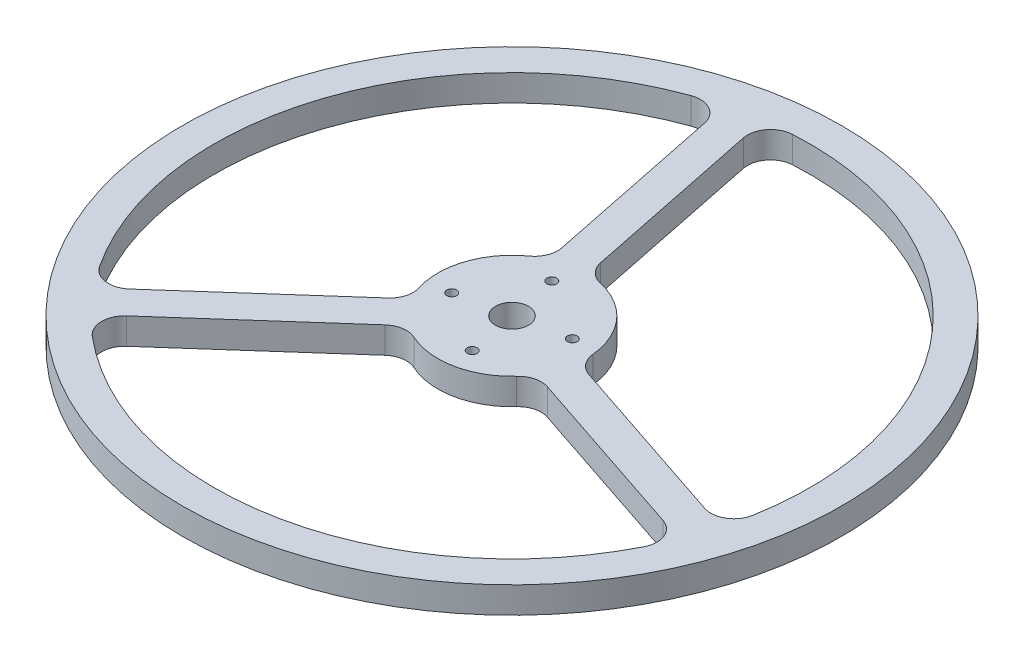
ISO-10303-21;
HEADER;
FILE_DESCRIPTION(('STEP AP214'),'2;1');
FILE_NAME('part.step','',(''),(''),'','','');
FILE_SCHEMA(('AUTOMOTIVE_DESIGN { 1 0 10303 214 1 1 1 1 }'));
ENDSEC;
DATA;
#1=APPLICATION_CONTEXT('core data for automotive mechanical design processes');
#2=APPLICATION_PROTOCOL_DEFINITION('international standard','automotive_design',2000,#1);
#3=PRODUCT_CONTEXT('',#1,'mechanical');
#4=PRODUCT('Part','Part','',(#3));
#5=PRODUCT_RELATED_PRODUCT_CATEGORY('part','',(#4));
#6=PRODUCT_DEFINITION_FORMATION('','',#4);
#7=PRODUCT_DEFINITION_CONTEXT('part definition',#1,'design');
#8=PRODUCT_DEFINITION('design','',#6,#7);
#9=PRODUCT_DEFINITION_SHAPE('','',#8);
#10=(LENGTH_UNIT() NAMED_UNIT(*) SI_UNIT(.MILLI.,.METRE.));
#11=(NAMED_UNIT(*) PLANE_ANGLE_UNIT() SI_UNIT($,.RADIAN.));
#12=(NAMED_UNIT(*) SI_UNIT($,.STERADIAN.) SOLID_ANGLE_UNIT());
#13=UNCERTAINTY_MEASURE_WITH_UNIT(LENGTH_MEASURE(1.E-05),#10,'distance_accuracy_value','');
#14=(GEOMETRIC_REPRESENTATION_CONTEXT(3) GLOBAL_UNCERTAINTY_ASSIGNED_CONTEXT((#13)) GLOBAL_UNIT_ASSIGNED_CONTEXT((#10,
#11,#12)) REPRESENTATION_CONTEXT('',''));
#15=CARTESIAN_POINT('',(0.,0.,0.));
#16=DIRECTION('',(0.,0.,1.));
#17=DIRECTION('',(1.,0.,0.));
#18=AXIS2_PLACEMENT_3D('',#15,#16,#17);
#19=CARTESIAN_POINT('',(0.,8.,0.));
#20=DIRECTION('',(0.,1.,0.));
#21=DIRECTION('',(0.,0.,1.));
#22=AXIS2_PLACEMENT_3D('',#19,#20,#21);
#23=PLANE('',#22);
#24=CARTESIAN_POINT('',(-15.1859574409984,8.,3.10430291695036));
#25=DIRECTION('',(0.,1.,0.));
#26=DIRECTION('',(0.,0.,1.));
#27=AXIS2_PLACEMENT_3D('',#24,#25,#26);
#28=CIRCLE('',#27,1.5);
#29=CARTESIAN_POINT('',(-15.1859574409984,8.,4.60430291695036));
#30=VERTEX_POINT('',#29);
#31=EDGE_CURVE('E487',#30,#30,#28,.T.);
#32=ORIENTED_EDGE('',*,*,#31,.F.);
#33=EDGE_LOOP('',(#32));
#34=FACE_BOUND('',#33,.T.);
#35=CARTESIAN_POINT('',(3.10430291695041,8.,15.1859574409984));
#36=DIRECTION('',(0.,1.,0.));
#37=DIRECTION('',(0.,0.,1.));
#38=AXIS2_PLACEMENT_3D('',#35,#36,#37);
#39=CIRCLE('',#38,1.5);
#40=CARTESIAN_POINT('',(3.10430291695041,8.,16.6859574409984));
#41=VERTEX_POINT('',#40);
#42=EDGE_CURVE('E494',#41,#41,#39,.T.);
#43=ORIENTED_EDGE('',*,*,#42,.F.);
#44=EDGE_LOOP('',(#43));
#45=FACE_BOUND('',#44,.T.);
#46=CARTESIAN_POINT('',(15.1859574409983,8.,-3.10430291695047));
#47=DIRECTION('',(0.,1.,0.));
#48=DIRECTION('',(0.,0.,1.));
#49=AXIS2_PLACEMENT_3D('',#46,#47,#48);
#50=CIRCLE('',#49,1.5);
#51=CARTESIAN_POINT('',(15.1859574409983,8.,-1.60430291695047));
#52=VERTEX_POINT('',#51);
#53=EDGE_CURVE('E502',#52,#52,#50,.T.);
#54=ORIENTED_EDGE('',*,*,#53,.F.);
#55=EDGE_LOOP('',(#54));
#56=FACE_BOUND('',#55,.T.);
#57=CARTESIAN_POINT('',(-3.10430291695052,8.,-15.1859574409983));
#58=DIRECTION('',(0.,1.,0.));
#59=DIRECTION('',(0.,0.,1.));
#60=AXIS2_PLACEMENT_3D('',#57,#58,#59);
#61=CIRCLE('',#60,1.5);
#62=CARTESIAN_POINT('',(-3.10430291695052,8.,-13.6859574409983));
#63=VERTEX_POINT('',#62);
#64=EDGE_CURVE('E510',#63,#63,#61,.T.);
#65=ORIENTED_EDGE('',*,*,#64,.F.);
#66=EDGE_LOOP('',(#65));
#67=FACE_BOUND('',#66,.T.);
#68=CARTESIAN_POINT('',(0.,8.,0.));
#69=DIRECTION('',(0.,1.,0.));
#70=DIRECTION('',(0.,0.,1.));
#71=AXIS2_PLACEMENT_3D('',#68,#69,#70);
#72=CIRCLE('',#71,5.);
#73=CARTESIAN_POINT('',(0.,8.,5.));
#74=VERTEX_POINT('',#73);
#75=EDGE_CURVE('E479',#74,#74,#72,.T.);
#76=ORIENTED_EDGE('',*,*,#75,.F.);
#77=EDGE_LOOP('',(#76));
#78=FACE_BOUND('',#77,.T.);
#79=CARTESIAN_POINT('',(0.,8.,0.));
#80=DIRECTION('',(0.,1.,0.));
#81=DIRECTION('',(0.,0.,1.));
#82=AXIS2_PLACEMENT_3D('',#79,#80,#81);
#83=CIRCLE('',#82,100.);
#84=CARTESIAN_POINT('',(0.,8.,100.));
#85=VERTEX_POINT('',#84);
#86=EDGE_CURVE('E235',#85,#85,#83,.T.);
#87=ORIENTED_EDGE('',*,*,#86,.T.);
#88=EDGE_LOOP('',(#87));
#89=FACE_BOUND('',#88,.T.);
#90=DIRECTION('',(-0.200277607545195,0.,-0.979739189741828));
#91=VECTOR('',#90,1.);
#92=CARTESIAN_POINT('',(-22.9719391340937,8.,-87.4112151059373));
#93=LINE('',#92,#91);
#94=CARTESIAN_POINT('',(-10.295982392935,8.,-25.4016288171521));
#95=VERTEX_POINT('',#94);
#96=CARTESIAN_POINT('',(-21.4238674204824,8.,-79.8381941129962));
#97=VERTEX_POINT('',#96);
#98=EDGE_CURVE('E416',#95,#97,#93,.T.);
#99=ORIENTED_EDGE('',*,*,#98,.F.);
#100=CARTESIAN_POINT('',(-17.1541567211278,8.,-23.9996855643357));
#101=DIRECTION('',(0.,1.,0.));
#102=DIRECTION('',(0.,0.,1.));
#103=AXIS2_PLACEMENT_3D('',#100,#101,#102);
#104=CIRCLE('',#103,7.);
#105=CARTESIAN_POINT('',(-13.0836788550975,8.,-18.304844921951));
#106=VERTEX_POINT('',#105);
#107=EDGE_CURVE('E381',#95,#106,#104,.F.);
#108=ORIENTED_EDGE('',*,*,#107,.T.);
#109=CARTESIAN_POINT('',(0.,8.,0.));
#110=DIRECTION('',(0.,-1.,0.));
#111=DIRECTION('',(0.,0.,1.));
#112=AXIS2_PLACEMENT_3D('',#109,#110,#111);
#113=CIRCLE('',#112,22.5);
#114=CARTESIAN_POINT('',(-21.452660237693,8.,6.7847895122919));
#115=VERTEX_POINT('',#114);
#116=EDGE_CURVE('E427',#115,#106,#113,.T.);
#117=ORIENTED_EDGE('',*,*,#116,.F.);
#118=CARTESIAN_POINT('',(-28.1268212005308,8.,8.89561291611605));
#119=DIRECTION('',(0.,1.,0.));
#120=DIRECTION('',(0.,0.,1.));
#121=AXIS2_PLACEMENT_3D('',#118,#119,#120);
#122=CIRCLE('',#121,7.);
#123=CARTESIAN_POINT('',(-23.4836155648312,8.,14.1339944815051));
#124=VERTEX_POINT('',#123);
#125=EDGE_CURVE('E11',#115,#124,#122,.F.);
#126=ORIENTED_EDGE('',*,*,#125,.T.);
#127=DIRECTION('',(0.748340223627005,0.,-0.663315090814226));
#128=VECTOR('',#127,1.);
#129=CARTESIAN_POINT('',(-70.8475141985029,8.,56.1164881810139));
#130=LINE('',#129,#128);
#131=CARTESIAN_POINT('',(-65.0631214920288,8.,50.9893082536759));
#132=VERTEX_POINT('',#131);
#133=EDGE_CURVE('E405',#132,#124,#130,.T.);
#134=ORIENTED_EDGE('',*,*,#133,.F.);
#135=CARTESIAN_POINT('',(-69.7063271277284,8.,45.7509266882868));
#136=DIRECTION('',(0.,1.,0.));
#137=DIRECTION('',(0.,0.,1.));
#138=AXIS2_PLACEMENT_3D('',#135,#136,#137);
#139=CIRCLE('',#138,7.);
#140=CARTESIAN_POINT('',(-75.5584256761347,8.,49.5918826343686));
#141=VERTEX_POINT('',#140);
#142=EDGE_CURVE('E296',#132,#141,#139,.F.);
#143=ORIENTED_EDGE('',*,*,#142,.T.);
#144=CARTESIAN_POINT('',(0.,8.,0.));
#145=DIRECTION('',(0.,1.,0.));
#146=DIRECTION('',(0.,0.,1.));
#147=AXIS2_PLACEMENT_3D('',#144,#145,#146);
#148=CIRCLE('',#147,90.3793699572914);
#149=CARTESIAN_POINT('',(-30.6564215544009,8.,-85.0212581144023));
#150=VERTEX_POINT('',#149);
#151=EDGE_CURVE('E408',#150,#141,#148,.T.);
#152=ORIENTED_EDGE('',*,*,#151,.F.);
#153=CARTESIAN_POINT('',(-28.2820417486752,8.,-78.4362508601799));
#154=DIRECTION('',(0.,1.,0.));
#155=DIRECTION('',(0.,0.,1.));
#156=AXIS2_PLACEMENT_3D('',#153,#154,#155);
#157=CIRCLE('',#156,7.);
#158=EDGE_CURVE('E289',#150,#97,#157,.F.);
#159=ORIENTED_EDGE('',*,*,#158,.T.);
#160=EDGE_LOOP('',(#99,#108,#117,#126,#134,#143,#152,#159));
#161=FACE_BOUND('',#160,.T.);
#162=DIRECTION('',(0.200277607545195,0.,0.979739189741828));
#163=VECTOR('',#162,1.);
#164=CARTESIAN_POINT('',(-13.1745472366754,8.,-89.4139911813893));
#165=LINE('',#164,#163);
#166=CARTESIAN_POINT('',(-11.6264755230641,8.,-81.8409701884482));
#167=VERTEX_POINT('',#166);
#168=CARTESIAN_POINT('',(-0.498590495516737,8.,-27.4044048926041));
#169=VERTEX_POINT('',#168);
#170=EDGE_CURVE('E444',#167,#169,#165,.T.);
#171=ORIENTED_EDGE('',*,*,#170,.F.);
#172=CARTESIAN_POINT('',(-4.76830119487127,8.,-83.2429134412645));
#173=DIRECTION('',(0.,1.,0.));
#174=DIRECTION('',(0.,0.,1.));
#175=AXIS2_PLACEMENT_3D('',#172,#173,#174);
#176=CIRCLE('',#175,7.);
#177=CARTESIAN_POINT('',(-5.16861734479176,8.,-90.2314574226753));
#178=VERTEX_POINT('',#177);
#179=EDGE_CURVE('E283',#167,#178,#176,.F.);
#180=ORIENTED_EDGE('',*,*,#179,.T.);
#181=CARTESIAN_POINT('',(0.,8.,0.));
#182=DIRECTION('',(0.,1.,0.));
#183=DIRECTION('',(0.,0.,1.));
#184=AXIS2_PLACEMENT_3D('',#181,#182,#183);
#185=CIRCLE('',#184,90.3793699572914);
#186=CARTESIAN_POINT('',(88.9587801659866,8.,15.9613892019656));
#187=VERTEX_POINT('',#186);
#188=EDGE_CURVE('E432',#187,#178,#185,.T.);
#189=ORIENTED_EDGE('',*,*,#188,.F.);
#190=CARTESIAN_POINT('',(82.0688066968623,8.,14.7251588048456));
#191=DIRECTION('',(0.,1.,0.));
#192=DIRECTION('',(0.,0.,1.));
#193=AXIS2_PLACEMENT_3D('',#190,#191,#192);
#194=CIRCLE('',#193,7.);
#195=CARTESIAN_POINT('',(79.853838004369,8.,21.365483623051));
#196=VERTEX_POINT('',#195);
#197=EDGE_CURVE('E216',#187,#196,#194,.F.);
#198=ORIENTED_EDGE('',*,*,#197,.T.);
#199=DIRECTION('',(0.948617831172201,0.,0.31642409892761));
#200=VECTOR('',#199,1.);
#201=CARTESIAN_POINT('',(22.3923397090911,8.,2.19843634264506));
#202=LINE('',#201,#200);
#203=CARTESIAN_POINT('',(27.1464470496241,8.,3.78423209937717));
#204=VERTEX_POINT('',#203);
#205=EDGE_CURVE('E400',#204,#196,#202,.T.);
#206=ORIENTED_EDGE('',*,*,#205,.F.);
#207=CARTESIAN_POINT('',(29.3614157421174,8.,-2.85609271882824));
#208=DIRECTION('',(0.,1.,0.));
#209=DIRECTION('',(0.,0.,1.));
#210=AXIS2_PLACEMENT_3D('',#207,#208,#209);
#211=CIRCLE('',#210,7.);
#212=CARTESIAN_POINT('',(22.3943001422929,8.,-2.17837580249611));
#213=VERTEX_POINT('',#212);
#214=EDGE_CURVE('E369',#204,#213,#211,.F.);
#215=ORIENTED_EDGE('',*,*,#214,.T.);
#216=CARTESIAN_POINT('',(0.,8.,0.));
#217=DIRECTION('',(0.,-1.,0.));
#218=DIRECTION('',(0.,0.,1.));
#219=AXIS2_PLACEMENT_3D('',#216,#217,#218);
#220=CIRCLE('',#219,22.5);
#221=CARTESIAN_POINT('',(4.85053004187157,8.,-21.9709435007444));
#222=VERTEX_POINT('',#221);
#223=EDGE_CURVE('E440',#222,#213,#220,.T.);
#224=ORIENTED_EDGE('',*,*,#223,.F.);
#225=CARTESIAN_POINT('',(6.35958383267606,8.,-28.8063481454204));
#226=DIRECTION('',(0.,1.,0.));
#227=DIRECTION('',(0.,0.,1.));
#228=AXIS2_PLACEMENT_3D('',#225,#226,#227);
#229=CIRCLE('',#228,7.);
#230=EDGE_CURVE('E375',#222,#169,#229,.F.);
#231=ORIENTED_EDGE('',*,*,#230,.T.);
#232=EDGE_LOOP('',(#171,#180,#189,#198,#206,#215,#224,#231));
#233=FACE_BOUND('',#232,.T.);
#234=DIRECTION('',(-0.748340223627005,0.,0.663315090814225));
#235=VECTOR('',#234,1.);
#236=CARTESIAN_POINT('',(-64.2143632903607,8.,63.599890417284));
#237=LINE('',#236,#235);
#238=CARTESIAN_POINT('',(-16.8504646566889,8.,21.6173967177752));
#239=VERTEX_POINT('',#238);
#240=CARTESIAN_POINT('',(-58.4299705838865,8.,58.4727104899459));
#241=VERTEX_POINT('',#240);
#242=EDGE_CURVE('E473',#239,#241,#237,.T.);
#243=ORIENTED_EDGE('',*,*,#242,.F.);
#244=CARTESIAN_POINT('',(-12.2072590209894,8.,26.8557782831642));
#245=DIRECTION('',(0.,1.,0.));
#246=DIRECTION('',(0.,0.,1.));
#247=AXIS2_PLACEMENT_3D('',#244,#245,#246);
#248=CIRCLE('',#247,7.);
#249=CARTESIAN_POINT('',(-9.31062128719527,8.,20.4832207244473));
#250=VERTEX_POINT('',#249);
#251=EDGE_CURVE('E357',#239,#250,#248,.F.);
#252=ORIENTED_EDGE('',*,*,#251,.T.);
#253=CARTESIAN_POINT('',(0.,8.,0.));
#254=DIRECTION('',(0.,-1.,0.));
#255=DIRECTION('',(0.,0.,1.));
#256=AXIS2_PLACEMENT_3D('',#253,#254,#255);
#257=CIRCLE('',#256,22.5);
#258=CARTESIAN_POINT('',(16.6021301958214,8.,15.1861539884526));
#259=VERTEX_POINT('',#258);
#260=EDGE_CURVE('E454',#259,#250,#257,.T.);
#261=ORIENTED_EDGE('',*,*,#260,.F.);
#262=CARTESIAN_POINT('',(21.7672373678547,8.,19.9107352293046));
#263=DIRECTION('',(0.,1.,0.));
#264=DIRECTION('',(0.,0.,1.));
#265=AXIS2_PLACEMENT_3D('',#262,#263,#264);
#266=CIRCLE('',#265,7.);
#267=CARTESIAN_POINT('',(23.982206060348,8.,13.2704104110992));
#268=VERTEX_POINT('',#267);
#269=EDGE_CURVE('E363',#259,#268,#266,.F.);
#270=ORIENTED_EDGE('',*,*,#269,.T.);
#271=DIRECTION('',(-0.948617831172201,0.,-0.31642409892761));
#272=VECTOR('',#271,1.);
#273=CARTESIAN_POINT('',(19.228098719815,8.,11.6846146543671));
#274=LINE('',#273,#272);
#275=CARTESIAN_POINT('',(76.6895970150929,8.,30.851661934773));
#276=VERTEX_POINT('',#275);
#277=EDGE_CURVE('E229',#276,#268,#274,.T.);
#278=ORIENTED_EDGE('',*,*,#277,.F.);
#279=CARTESIAN_POINT('',(74.4746283225996,8.,37.4919867529784));
#280=DIRECTION('',(0.,1.,0.));
#281=DIRECTION('',(0.,0.,1.));
#282=AXIS2_PLACEMENT_3D('',#279,#280,#281);
#283=CIRCLE('',#282,7.);
#284=CARTESIAN_POINT('',(80.7270430209265,8.,40.6395747883075));
#285=VERTEX_POINT('',#284);
#286=EDGE_CURVE('E217',#276,#285,#283,.F.);
#287=ORIENTED_EDGE('',*,*,#286,.T.);
#288=CARTESIAN_POINT('',(0.,8.,0.));
#289=DIRECTION('',(0.,1.,0.));
#290=DIRECTION('',(0.,0.,1.));
#291=AXIS2_PLACEMENT_3D('',#288,#289,#290);
#292=CIRCLE('',#291,90.3793699572914);
#293=CARTESIAN_POINT('',(-58.3023586115855,8.,69.0598689124374));
#294=VERTEX_POINT('',#293);
#295=EDGE_CURVE('E469',#294,#285,#292,.T.);
#296=ORIENTED_EDGE('',*,*,#295,.F.);
#297=CARTESIAN_POINT('',(-53.7867649481869,8.,63.7110920553349));
#298=DIRECTION('',(0.,1.,0.));
#299=DIRECTION('',(0.,0.,1.));
#300=AXIS2_PLACEMENT_3D('',#297,#298,#299);
#301=CIRCLE('',#300,7.);
#302=EDGE_CURVE('E302',#294,#241,#301,.F.);
#303=ORIENTED_EDGE('',*,*,#302,.T.);
#304=EDGE_LOOP('',(#243,#252,#261,#270,#278,#287,#296,#303));
#305=FACE_BOUND('',#304,.T.);
#306=ADVANCED_FACE('F41',(#34,#45,#56,#67,#78,#89,#161,#233,#305),#23,.T.);
#307=CARTESIAN_POINT('',(0.,0.,0.));
#308=DIRECTION('',(0.,1.,0.));
#309=DIRECTION('',(0.,0.,1.));
#310=AXIS2_PLACEMENT_3D('',#307,#308,#309);
#311=PLANE('',#310);
#312=CARTESIAN_POINT('',(-15.1859574409984,0.,3.10430291695036));
#313=DIRECTION('',(0.,1.,0.));
#314=DIRECTION('',(0.,0.,1.));
#315=AXIS2_PLACEMENT_3D('',#312,#313,#314);
#316=CIRCLE('',#315,1.5);
#317=CARTESIAN_POINT('',(-15.1859574409984,0.,4.60430291695036));
#318=VERTEX_POINT('',#317);
#319=EDGE_CURVE('E491',#318,#318,#316,.T.);
#320=ORIENTED_EDGE('',*,*,#319,.T.);
#321=EDGE_LOOP('',(#320));
#322=FACE_BOUND('',#321,.T.);
#323=CARTESIAN_POINT('',(3.10430291695041,0.,15.1859574409984));
#324=DIRECTION('',(0.,1.,0.));
#325=DIRECTION('',(0.,0.,1.));
#326=AXIS2_PLACEMENT_3D('',#323,#324,#325);
#327=CIRCLE('',#326,1.5);
#328=CARTESIAN_POINT('',(3.10430291695041,0.,16.6859574409984));
#329=VERTEX_POINT('',#328);
#330=EDGE_CURVE('E498',#329,#329,#327,.T.);
#331=ORIENTED_EDGE('',*,*,#330,.T.);
#332=EDGE_LOOP('',(#331));
#333=FACE_BOUND('',#332,.T.);
#334=CARTESIAN_POINT('',(15.1859574409983,0.,-3.10430291695047));
#335=DIRECTION('',(0.,1.,0.));
#336=DIRECTION('',(0.,0.,1.));
#337=AXIS2_PLACEMENT_3D('',#334,#335,#336);
#338=CIRCLE('',#337,1.5);
#339=CARTESIAN_POINT('',(15.1859574409983,0.,-1.60430291695047));
#340=VERTEX_POINT('',#339);
#341=EDGE_CURVE('E506',#340,#340,#338,.T.);
#342=ORIENTED_EDGE('',*,*,#341,.T.);
#343=EDGE_LOOP('',(#342));
#344=FACE_BOUND('',#343,.T.);
#345=CARTESIAN_POINT('',(-3.10430291695052,0.,-15.1859574409983));
#346=DIRECTION('',(0.,1.,0.));
#347=DIRECTION('',(0.,0.,1.));
#348=AXIS2_PLACEMENT_3D('',#345,#346,#347);
#349=CIRCLE('',#348,1.5);
#350=CARTESIAN_POINT('',(-3.10430291695052,0.,-13.6859574409983));
#351=VERTEX_POINT('',#350);
#352=EDGE_CURVE('E483',#351,#351,#349,.T.);
#353=ORIENTED_EDGE('',*,*,#352,.T.);
#354=EDGE_LOOP('',(#353));
#355=FACE_BOUND('',#354,.T.);
#356=CARTESIAN_POINT('',(0.,0.,0.));
#357=DIRECTION('',(0.,1.,0.));
#358=DIRECTION('',(0.,0.,1.));
#359=AXIS2_PLACEMENT_3D('',#356,#357,#358);
#360=CIRCLE('',#359,5.);
#361=CARTESIAN_POINT('',(0.,0.,5.));
#362=VERTEX_POINT('',#361);
#363=EDGE_CURVE('E465',#362,#362,#360,.T.);
#364=ORIENTED_EDGE('',*,*,#363,.T.);
#365=EDGE_LOOP('',(#364));
#366=FACE_BOUND('',#365,.T.);
#367=CARTESIAN_POINT('',(0.,0.,0.));
#368=DIRECTION('',(0.,-1.,0.));
#369=DIRECTION('',(0.,0.,1.));
#370=AXIS2_PLACEMENT_3D('',#367,#368,#369);
#371=CIRCLE('',#370,22.5);
#372=CARTESIAN_POINT('',(4.85053004187157,0.,-21.9709435007444));
#373=VERTEX_POINT('',#372);
#374=CARTESIAN_POINT('',(22.3943001422929,0.,-2.17837580249611));
#375=VERTEX_POINT('',#374);
#376=EDGE_CURVE('E433',#373,#375,#371,.T.);
#377=ORIENTED_EDGE('',*,*,#376,.T.);
#378=CARTESIAN_POINT('',(29.3614157421174,0.,-2.85609271882824));
#379=DIRECTION('',(0.,1.,0.));
#380=DIRECTION('',(0.,0.,1.));
#381=AXIS2_PLACEMENT_3D('',#378,#379,#380);
#382=CIRCLE('',#381,7.);
#383=CARTESIAN_POINT('',(27.1464470496241,0.,3.78423209937717));
#384=VERTEX_POINT('',#383);
#385=EDGE_CURVE('E366',#375,#384,#382,.T.);
#386=ORIENTED_EDGE('',*,*,#385,.T.);
#387=DIRECTION('',(0.948617831172201,0.,0.31642409892761));
#388=VECTOR('',#387,1.);
#389=CARTESIAN_POINT('',(22.3923397090911,0.,2.19843634264506));
#390=LINE('',#389,#388);
#391=CARTESIAN_POINT('',(79.853838004369,0.,21.365483623051));
#392=VERTEX_POINT('',#391);
#393=EDGE_CURVE('E210',#384,#392,#390,.T.);
#394=ORIENTED_EDGE('',*,*,#393,.T.);
#395=CARTESIAN_POINT('',(82.0688066968623,0.,14.7251588048456));
#396=DIRECTION('',(0.,1.,0.));
#397=DIRECTION('',(0.,0.,1.));
#398=AXIS2_PLACEMENT_3D('',#395,#396,#397);
#399=CIRCLE('',#398,7.);
#400=CARTESIAN_POINT('',(88.9587801659866,0.,15.9613892019656));
#401=VERTEX_POINT('',#400);
#402=EDGE_CURVE('E203',#392,#401,#399,.T.);
#403=ORIENTED_EDGE('',*,*,#402,.T.);
#404=CARTESIAN_POINT('',(0.,0.,0.));
#405=DIRECTION('',(0.,1.,0.));
#406=DIRECTION('',(0.,0.,1.));
#407=AXIS2_PLACEMENT_3D('',#404,#405,#406);
#408=CIRCLE('',#407,90.3793699572914);
#409=CARTESIAN_POINT('',(-5.16861734479176,0.,-90.2314574226753));
#410=VERTEX_POINT('',#409);
#411=EDGE_CURVE('E208',#401,#410,#408,.T.);
#412=ORIENTED_EDGE('',*,*,#411,.T.);
#413=CARTESIAN_POINT('',(-4.76830119487127,0.,-83.2429134412645));
#414=DIRECTION('',(0.,1.,0.));
#415=DIRECTION('',(0.,0.,1.));
#416=AXIS2_PLACEMENT_3D('',#413,#414,#415);
#417=CIRCLE('',#416,7.);
#418=CARTESIAN_POINT('',(-11.6264755230641,0.,-81.8409701884482));
#419=VERTEX_POINT('',#418);
#420=EDGE_CURVE('E280',#410,#419,#417,.T.);
#421=ORIENTED_EDGE('',*,*,#420,.T.);
#422=DIRECTION('',(0.200277607545195,0.,0.979739189741828));
#423=VECTOR('',#422,1.);
#424=CARTESIAN_POINT('',(-13.1745472366754,0.,-89.4139911813893));
#425=LINE('',#424,#423);
#426=CARTESIAN_POINT('',(-0.498590495516737,0.,-27.4044048926041));
#427=VERTEX_POINT('',#426);
#428=EDGE_CURVE('E228',#419,#427,#425,.T.);
#429=ORIENTED_EDGE('',*,*,#428,.T.);
#430=CARTESIAN_POINT('',(6.35958383267606,0.,-28.8063481454204));
#431=DIRECTION('',(0.,1.,0.));
#432=DIRECTION('',(0.,0.,1.));
#433=AXIS2_PLACEMENT_3D('',#430,#431,#432);
#434=CIRCLE('',#433,7.);
#435=EDGE_CURVE('E372',#427,#373,#434,.T.);
#436=ORIENTED_EDGE('',*,*,#435,.T.);
#437=EDGE_LOOP('',(#377,#386,#394,#403,#412,#421,#429,#436));
#438=FACE_BOUND('',#437,.T.);
#439=CARTESIAN_POINT('',(0.,0.,0.));
#440=DIRECTION('',(0.,1.,0.));
#441=DIRECTION('',(0.,0.,1.));
#442=AXIS2_PLACEMENT_3D('',#439,#440,#441);
#443=CIRCLE('',#442,100.);
#444=CARTESIAN_POINT('',(0.,0.,100.));
#445=VERTEX_POINT('',#444);
#446=EDGE_CURVE('E243',#445,#445,#443,.T.);
#447=ORIENTED_EDGE('',*,*,#446,.F.);
#448=EDGE_LOOP('',(#447));
#449=FACE_BOUND('',#448,.T.);
#450=DIRECTION('',(0.748340223627005,0.,-0.663315090814226));
#451=VECTOR('',#450,1.);
#452=CARTESIAN_POINT('',(-70.8475141985029,0.,56.1164881810139));
#453=LINE('',#452,#451);
#454=CARTESIAN_POINT('',(-65.0631214920288,0.,50.9893082536759));
#455=VERTEX_POINT('',#454);
#456=CARTESIAN_POINT('',(-23.4836155648312,0.,14.1339944815051));
#457=VERTEX_POINT('',#456);
#458=EDGE_CURVE('E393',#455,#457,#453,.T.);
#459=ORIENTED_EDGE('',*,*,#458,.T.);
#460=CARTESIAN_POINT('',(-28.1268212005308,0.,8.89561291611605));
#461=DIRECTION('',(0.,1.,0.));
#462=DIRECTION('',(0.,0.,1.));
#463=AXIS2_PLACEMENT_3D('',#460,#461,#462);
#464=CIRCLE('',#463,7.);
#465=CARTESIAN_POINT('',(-21.452660237693,0.,6.7847895122919));
#466=VERTEX_POINT('',#465);
#467=EDGE_CURVE('E50',#457,#466,#464,.T.);
#468=ORIENTED_EDGE('',*,*,#467,.T.);
#469=CARTESIAN_POINT('',(0.,0.,0.));
#470=DIRECTION('',(0.,-1.,0.));
#471=DIRECTION('',(0.,0.,1.));
#472=AXIS2_PLACEMENT_3D('',#469,#470,#471);
#473=CIRCLE('',#472,22.5);
#474=CARTESIAN_POINT('',(-13.0836788550975,0.,-18.304844921951));
#475=VERTEX_POINT('',#474);
#476=EDGE_CURVE('E391',#466,#475,#473,.T.);
#477=ORIENTED_EDGE('',*,*,#476,.T.);
#478=CARTESIAN_POINT('',(-17.1541567211278,0.,-23.9996855643357));
#479=DIRECTION('',(0.,1.,0.));
#480=DIRECTION('',(0.,0.,1.));
#481=AXIS2_PLACEMENT_3D('',#478,#479,#480);
#482=CIRCLE('',#481,7.);
#483=CARTESIAN_POINT('',(-10.295982392935,0.,-25.4016288171521));
#484=VERTEX_POINT('',#483);
#485=EDGE_CURVE('E378',#475,#484,#482,.T.);
#486=ORIENTED_EDGE('',*,*,#485,.T.);
#487=DIRECTION('',(-0.200277607545195,0.,-0.979739189741828));
#488=VECTOR('',#487,1.);
#489=CARTESIAN_POINT('',(-22.9719391340937,0.,-87.4112151059373));
#490=LINE('',#489,#488);
#491=CARTESIAN_POINT('',(-21.4238674204824,0.,-79.8381941129962));
#492=VERTEX_POINT('',#491);
#493=EDGE_CURVE('E399',#484,#492,#490,.T.);
#494=ORIENTED_EDGE('',*,*,#493,.T.);
#495=CARTESIAN_POINT('',(-28.2820417486752,0.,-78.4362508601799));
#496=DIRECTION('',(0.,1.,0.));
#497=DIRECTION('',(0.,0.,1.));
#498=AXIS2_PLACEMENT_3D('',#495,#496,#497);
#499=CIRCLE('',#498,7.);
#500=CARTESIAN_POINT('',(-30.6564215544009,0.,-85.0212581144023));
#501=VERTEX_POINT('',#500);
#502=EDGE_CURVE('E286',#492,#501,#499,.T.);
#503=ORIENTED_EDGE('',*,*,#502,.T.);
#504=CARTESIAN_POINT('',(0.,0.,0.));
#505=DIRECTION('',(0.,1.,0.));
#506=DIRECTION('',(0.,0.,1.));
#507=AXIS2_PLACEMENT_3D('',#504,#505,#506);
#508=CIRCLE('',#507,90.3793699572914);
#509=CARTESIAN_POINT('',(-75.5584256761347,0.,49.5918826343686));
#510=VERTEX_POINT('',#509);
#511=EDGE_CURVE('E422',#501,#510,#508,.T.);
#512=ORIENTED_EDGE('',*,*,#511,.T.);
#513=CARTESIAN_POINT('',(-69.7063271277284,0.,45.7509266882868));
#514=DIRECTION('',(0.,1.,0.));
#515=DIRECTION('',(0.,0.,1.));
#516=AXIS2_PLACEMENT_3D('',#513,#514,#515);
#517=CIRCLE('',#516,7.);
#518=EDGE_CURVE('E293',#510,#455,#517,.T.);
#519=ORIENTED_EDGE('',*,*,#518,.T.);
#520=EDGE_LOOP('',(#459,#468,#477,#486,#494,#503,#512,#519));
#521=FACE_BOUND('',#520,.T.);
#522=DIRECTION('',(-0.948617831172201,0.,-0.31642409892761));
#523=VECTOR('',#522,1.);
#524=CARTESIAN_POINT('',(19.228098719815,0.,11.6846146543671));
#525=LINE('',#524,#523);
#526=CARTESIAN_POINT('',(76.6895970150929,0.,30.851661934773));
#527=VERTEX_POINT('',#526);
#528=CARTESIAN_POINT('',(23.982206060348,0.,13.2704104110992));
#529=VERTEX_POINT('',#528);
#530=EDGE_CURVE('E450',#527,#529,#525,.T.);
#531=ORIENTED_EDGE('',*,*,#530,.T.);
#532=CARTESIAN_POINT('',(21.7672373678547,0.,19.9107352293046));
#533=DIRECTION('',(0.,1.,0.));
#534=DIRECTION('',(0.,0.,1.));
#535=AXIS2_PLACEMENT_3D('',#532,#533,#534);
#536=CIRCLE('',#535,7.);
#537=CARTESIAN_POINT('',(16.6021301958214,0.,15.1861539884526));
#538=VERTEX_POINT('',#537);
#539=EDGE_CURVE('E360',#529,#538,#536,.T.);
#540=ORIENTED_EDGE('',*,*,#539,.T.);
#541=CARTESIAN_POINT('',(0.,0.,0.));
#542=DIRECTION('',(0.,-1.,0.));
#543=DIRECTION('',(0.,0.,1.));
#544=AXIS2_PLACEMENT_3D('',#541,#542,#543);
#545=CIRCLE('',#544,22.5);
#546=CARTESIAN_POINT('',(-9.31062128719527,0.,20.4832207244473));
#547=VERTEX_POINT('',#546);
#548=EDGE_CURVE('E461',#538,#547,#545,.T.);
#549=ORIENTED_EDGE('',*,*,#548,.T.);
#550=CARTESIAN_POINT('',(-12.2072590209894,0.,26.8557782831642));
#551=DIRECTION('',(0.,1.,0.));
#552=DIRECTION('',(0.,0.,1.));
#553=AXIS2_PLACEMENT_3D('',#550,#551,#552);
#554=CIRCLE('',#553,7.);
#555=CARTESIAN_POINT('',(-16.8504646566889,0.,21.6173967177752));
#556=VERTEX_POINT('',#555);
#557=EDGE_CURVE('E354',#547,#556,#554,.T.);
#558=ORIENTED_EDGE('',*,*,#557,.T.);
#559=DIRECTION('',(-0.748340223627005,0.,0.663315090814225));
#560=VECTOR('',#559,1.);
#561=CARTESIAN_POINT('',(-64.2143632903607,0.,63.599890417284));
#562=LINE('',#561,#560);
#563=CARTESIAN_POINT('',(-58.4299705838865,0.,58.4727104899459));
#564=VERTEX_POINT('',#563);
#565=EDGE_CURVE('E459',#556,#564,#562,.T.);
#566=ORIENTED_EDGE('',*,*,#565,.T.);
#567=CARTESIAN_POINT('',(-53.7867649481869,0.,63.7110920553349));
#568=DIRECTION('',(0.,1.,0.));
#569=DIRECTION('',(0.,0.,1.));
#570=AXIS2_PLACEMENT_3D('',#567,#568,#569);
#571=CIRCLE('',#570,7.);
#572=CARTESIAN_POINT('',(-58.3023586115855,0.,69.0598689124374));
#573=VERTEX_POINT('',#572);
#574=EDGE_CURVE('E299',#564,#573,#571,.T.);
#575=ORIENTED_EDGE('',*,*,#574,.T.);
#576=CARTESIAN_POINT('',(0.,0.,0.));
#577=DIRECTION('',(0.,1.,0.));
#578=DIRECTION('',(0.,0.,1.));
#579=AXIS2_PLACEMENT_3D('',#576,#577,#578);
#580=CIRCLE('',#579,90.3793699572914);
#581=CARTESIAN_POINT('',(80.7270430209265,0.,40.6395747883075));
#582=VERTEX_POINT('',#581);
#583=EDGE_CURVE('E455',#573,#582,#580,.T.);
#584=ORIENTED_EDGE('',*,*,#583,.T.);
#585=CARTESIAN_POINT('',(74.4746283225996,0.,37.4919867529784));
#586=DIRECTION('',(0.,1.,0.));
#587=DIRECTION('',(0.,0.,1.));
#588=AXIS2_PLACEMENT_3D('',#585,#586,#587);
#589=CIRCLE('',#588,7.);
#590=EDGE_CURVE('E306',#582,#527,#589,.T.);
#591=ORIENTED_EDGE('',*,*,#590,.T.);
#592=EDGE_LOOP('',(#531,#540,#549,#558,#566,#575,#584,#591));
#593=FACE_BOUND('',#592,.T.);
#594=ADVANCED_FACE('F206',(#322,#333,#344,#355,#366,#438,#449,#521,#593),#311,.F.);
#595=CARTESIAN_POINT('',(0.,8.,0.));
#596=DIRECTION('',(0.,-1.,0.));
#597=DIRECTION('',(0.,0.,-1.));
#598=AXIS2_PLACEMENT_3D('',#595,#596,#597);
#599=CYLINDRICAL_SURFACE('',#598,100.);
#600=ORIENTED_EDGE('',*,*,#86,.F.);
#601=EDGE_LOOP('',(#600));
#602=FACE_BOUND('',#601,.T.);
#603=ORIENTED_EDGE('',*,*,#446,.T.);
#604=EDGE_LOOP('',(#603));
#605=FACE_BOUND('',#604,.T.);
#606=ADVANCED_FACE('F613',(#602,#605),#599,.T.);
#607=CARTESIAN_POINT('',(0.,8.,0.));
#608=DIRECTION('',(0.,-1.,0.));
#609=DIRECTION('',(0.,0.,-1.));
#610=AXIS2_PLACEMENT_3D('',#607,#608,#609);
#611=CYLINDRICAL_SURFACE('',#610,22.5);
#612=ORIENTED_EDGE('',*,*,#116,.T.);
#613=DIRECTION('',(0.,-1.,0.));
#614=VECTOR('',#613,1.);
#615=CARTESIAN_POINT('',(-13.0836788550975,8.,-18.304844921951));
#616=LINE('',#615,#614);
#617=EDGE_CURVE('E344',#106,#475,#616,.T.);
#618=ORIENTED_EDGE('',*,*,#617,.T.);
#619=ORIENTED_EDGE('',*,*,#476,.F.);
#620=DIRECTION('',(0.,-1.,0.));
#621=VECTOR('',#620,1.);
#622=CARTESIAN_POINT('',(-21.452660237693,8.,6.7847895122919));
#623=LINE('',#622,#621);
#624=EDGE_CURVE('E341',#466,#115,#623,.F.);
#625=ORIENTED_EDGE('',*,*,#624,.T.);
#626=EDGE_LOOP('',(#612,#618,#619,#625));
#627=FACE_BOUND('',#626,.T.);
#628=ADVANCED_FACE('F396',(#627),#611,.T.);
#629=CARTESIAN_POINT('',(-22.9719391340937,8.,-87.4112151059373));
#630=DIRECTION('',(-0.979739189741828,0.,0.200277607545195));
#631=DIRECTION('',(0.200277607545195,0.,0.979739189741828));
#632=AXIS2_PLACEMENT_3D('',#629,#630,#631);
#633=PLANE('',#632);
#634=ORIENTED_EDGE('',*,*,#493,.F.);
#635=DIRECTION('',(0.,1.,0.));
#636=VECTOR('',#635,1.);
#637=CARTESIAN_POINT('',(-10.295982392935,8.,-25.4016288171521));
#638=LINE('',#637,#636);
#639=EDGE_CURVE('E348',#484,#95,#638,.T.);
#640=ORIENTED_EDGE('',*,*,#639,.T.);
#641=ORIENTED_EDGE('',*,*,#98,.T.);
#642=DIRECTION('',(0.,1.,0.));
#643=VECTOR('',#642,1.);
#644=CARTESIAN_POINT('',(-21.4238674204824,0.,-79.8381941129962));
#645=LINE('',#644,#643);
#646=EDGE_CURVE('E249',#97,#492,#645,.F.);
#647=ORIENTED_EDGE('',*,*,#646,.T.);
#648=EDGE_LOOP('',(#634,#640,#641,#647));
#649=FACE_BOUND('',#648,.T.);
#650=ADVANCED_FACE('F607',(#649),#633,.T.);
#651=CARTESIAN_POINT('',(0.,8.,0.));
#652=DIRECTION('',(0.,-1.,0.));
#653=DIRECTION('',(0.,0.,-1.));
#654=AXIS2_PLACEMENT_3D('',#651,#652,#653);
#655=CYLINDRICAL_SURFACE('',#654,90.3793699572914);
#656=ORIENTED_EDGE('',*,*,#511,.F.);
#657=DIRECTION('',(0.,-1.,0.));
#658=VECTOR('',#657,1.);
#659=CARTESIAN_POINT('',(-30.6564215544009,8.,-85.0212581144023));
#660=LINE('',#659,#658);
#661=EDGE_CURVE('E257',#501,#150,#660,.F.);
#662=ORIENTED_EDGE('',*,*,#661,.T.);
#663=ORIENTED_EDGE('',*,*,#151,.T.);
#664=DIRECTION('',(0.,-1.,0.));
#665=VECTOR('',#664,1.);
#666=CARTESIAN_POINT('',(-75.5584256761347,8.,49.5918826343686));
#667=LINE('',#666,#665);
#668=EDGE_CURVE('E253',#141,#510,#667,.T.);
#669=ORIENTED_EDGE('',*,*,#668,.T.);
#670=EDGE_LOOP('',(#656,#662,#663,#669));
#671=FACE_BOUND('',#670,.T.);
#672=ADVANCED_FACE('F604',(#671),#655,.F.);
#673=CARTESIAN_POINT('',(-70.8475141985029,8.,56.1164881810139));
#674=DIRECTION('',(-0.663315090814226,0.,-0.748340223627005));
#675=DIRECTION('',(-0.748340223627005,0.,0.663315090814226));
#676=AXIS2_PLACEMENT_3D('',#673,#674,#675);
#677=PLANE('',#676);
#678=ORIENTED_EDGE('',*,*,#133,.T.);
#679=DIRECTION('',(0.,1.,0.));
#680=VECTOR('',#679,1.);
#681=CARTESIAN_POINT('',(-23.4836155648312,0.,14.1339944815051));
#682=LINE('',#681,#680);
#683=EDGE_CURVE('E351',#124,#457,#682,.F.);
#684=ORIENTED_EDGE('',*,*,#683,.T.);
#685=ORIENTED_EDGE('',*,*,#458,.F.);
#686=DIRECTION('',(0.,1.,0.));
#687=VECTOR('',#686,1.);
#688=CARTESIAN_POINT('',(-65.0631214920288,8.,50.9893082536759));
#689=LINE('',#688,#687);
#690=EDGE_CURVE('E260',#455,#132,#689,.T.);
#691=ORIENTED_EDGE('',*,*,#690,.T.);
#692=EDGE_LOOP('',(#678,#684,#685,#691));
#693=FACE_BOUND('',#692,.T.);
#694=ADVANCED_FACE('F403',(#693),#677,.T.);
#695=CARTESIAN_POINT('',(0.,8.,0.));
#696=DIRECTION('',(0.,-1.,0.));
#697=DIRECTION('',(0.,0.,-1.));
#698=AXIS2_PLACEMENT_3D('',#695,#696,#697);
#699=CYLINDRICAL_SURFACE('',#698,90.3793699572914);
#700=ORIENTED_EDGE('',*,*,#188,.T.);
#701=DIRECTION('',(0.,-1.,0.));
#702=VECTOR('',#701,1.);
#703=CARTESIAN_POINT('',(-5.16861734479176,8.,-90.2314574226753));
#704=LINE('',#703,#702);
#705=EDGE_CURVE('E226',#178,#410,#704,.T.);
#706=ORIENTED_EDGE('',*,*,#705,.T.);
#707=ORIENTED_EDGE('',*,*,#411,.F.);
#708=DIRECTION('',(0.,-1.,0.));
#709=VECTOR('',#708,1.);
#710=CARTESIAN_POINT('',(88.9587801659866,8.,15.9613892019656));
#711=LINE('',#710,#709);
#712=EDGE_CURVE('E223',#401,#187,#711,.F.);
#713=ORIENTED_EDGE('',*,*,#712,.T.);
#714=EDGE_LOOP('',(#700,#706,#707,#713));
#715=FACE_BOUND('',#714,.T.);
#716=ADVANCED_FACE('F222',(#715),#699,.F.);
#717=CARTESIAN_POINT('',(-13.1745472366754,8.,-89.4139911813893));
#718=DIRECTION('',(0.979739189741828,0.,-0.200277607545195));
#719=DIRECTION('',(-0.200277607545195,0.,-0.979739189741828));
#720=AXIS2_PLACEMENT_3D('',#717,#718,#719);
#721=PLANE('',#720);
#722=ORIENTED_EDGE('',*,*,#170,.T.);
#723=DIRECTION('',(0.,1.,0.));
#724=VECTOR('',#723,1.);
#725=CARTESIAN_POINT('',(-0.498590495516736,0.,-27.404404892604));
#726=LINE('',#725,#724);
#727=EDGE_CURVE('E337',#169,#427,#726,.F.);
#728=ORIENTED_EDGE('',*,*,#727,.T.);
#729=ORIENTED_EDGE('',*,*,#428,.F.);
#730=DIRECTION('',(0.,1.,0.));
#731=VECTOR('',#730,1.);
#732=CARTESIAN_POINT('',(-11.6264755230641,8.,-81.8409701884482));
#733=LINE('',#732,#731);
#734=EDGE_CURVE('E239',#419,#167,#733,.T.);
#735=ORIENTED_EDGE('',*,*,#734,.T.);
#736=EDGE_LOOP('',(#722,#728,#729,#735));
#737=FACE_BOUND('',#736,.T.);
#738=ADVANCED_FACE('F595',(#737),#721,.T.);
#739=CARTESIAN_POINT('',(0.,8.,0.));
#740=DIRECTION('',(0.,-1.,0.));
#741=DIRECTION('',(0.,0.,-1.));
#742=AXIS2_PLACEMENT_3D('',#739,#740,#741);
#743=CYLINDRICAL_SURFACE('',#742,22.5);
#744=ORIENTED_EDGE('',*,*,#223,.T.);
#745=DIRECTION('',(0.,-1.,0.));
#746=VECTOR('',#745,1.);
#747=CARTESIAN_POINT('',(22.3943001422929,8.,-2.17837580249611));
#748=LINE('',#747,#746);
#749=EDGE_CURVE('E330',#213,#375,#748,.T.);
#750=ORIENTED_EDGE('',*,*,#749,.T.);
#751=ORIENTED_EDGE('',*,*,#376,.F.);
#752=DIRECTION('',(0.,-1.,0.));
#753=VECTOR('',#752,1.);
#754=CARTESIAN_POINT('',(4.85053004187157,8.,-21.9709435007444));
#755=LINE('',#754,#753);
#756=EDGE_CURVE('E327',#373,#222,#755,.F.);
#757=ORIENTED_EDGE('',*,*,#756,.T.);
#758=EDGE_LOOP('',(#744,#750,#751,#757));
#759=FACE_BOUND('',#758,.T.);
#760=ADVANCED_FACE('F591',(#759),#743,.T.);
#761=CARTESIAN_POINT('',(22.3923397090911,8.,2.19843634264506));
#762=DIRECTION('',(0.31642409892761,0.,-0.948617831172201));
#763=DIRECTION('',(-0.948617831172201,0.,-0.31642409892761));
#764=AXIS2_PLACEMENT_3D('',#761,#762,#763);
#765=PLANE('',#764);
#766=ORIENTED_EDGE('',*,*,#393,.F.);
#767=DIRECTION('',(0.,1.,0.));
#768=VECTOR('',#767,1.);
#769=CARTESIAN_POINT('',(27.1464470496241,8.,3.78423209937717));
#770=LINE('',#769,#768);
#771=EDGE_CURVE('E334',#384,#204,#770,.T.);
#772=ORIENTED_EDGE('',*,*,#771,.T.);
#773=ORIENTED_EDGE('',*,*,#205,.T.);
#774=DIRECTION('',(0.,1.,0.));
#775=VECTOR('',#774,1.);
#776=CARTESIAN_POINT('',(79.853838004369,0.,21.365483623051));
#777=LINE('',#776,#775);
#778=EDGE_CURVE('E277',#196,#392,#777,.F.);
#779=ORIENTED_EDGE('',*,*,#778,.T.);
#780=EDGE_LOOP('',(#766,#772,#773,#779));
#781=FACE_BOUND('',#780,.T.);
#782=ADVANCED_FACE('F585',(#781),#765,.T.);
#783=CARTESIAN_POINT('',(0.,8.,0.));
#784=DIRECTION('',(0.,-1.,0.));
#785=DIRECTION('',(0.,0.,-1.));
#786=AXIS2_PLACEMENT_3D('',#783,#784,#785);
#787=CYLINDRICAL_SURFACE('',#786,22.5);
#788=ORIENTED_EDGE('',*,*,#260,.T.);
#789=DIRECTION('',(0.,-1.,0.));
#790=VECTOR('',#789,1.);
#791=CARTESIAN_POINT('',(-9.31062128719527,8.,20.4832207244473));
#792=LINE('',#791,#790);
#793=EDGE_CURVE('E316',#250,#547,#792,.T.);
#794=ORIENTED_EDGE('',*,*,#793,.T.);
#795=ORIENTED_EDGE('',*,*,#548,.F.);
#796=DIRECTION('',(0.,-1.,0.));
#797=VECTOR('',#796,1.);
#798=CARTESIAN_POINT('',(16.6021301958214,8.,15.1861539884526));
#799=LINE('',#798,#797);
#800=EDGE_CURVE('E313',#538,#259,#799,.F.);
#801=ORIENTED_EDGE('',*,*,#800,.T.);
#802=EDGE_LOOP('',(#788,#794,#795,#801));
#803=FACE_BOUND('',#802,.T.);
#804=ADVANCED_FACE('F554',(#803),#787,.T.);
#805=CARTESIAN_POINT('',(-64.2143632903607,8.,63.599890417284));
#806=DIRECTION('',(0.663315090814225,0.,0.748340223627005));
#807=DIRECTION('',(0.748340223627005,0.,-0.663315090814225));
#808=AXIS2_PLACEMENT_3D('',#805,#806,#807);
#809=PLANE('',#808);
#810=ORIENTED_EDGE('',*,*,#565,.F.);
#811=DIRECTION('',(0.,1.,0.));
#812=VECTOR('',#811,1.);
#813=CARTESIAN_POINT('',(-16.8504646566889,8.,21.6173967177752));
#814=LINE('',#813,#812);
#815=EDGE_CURVE('E320',#556,#239,#814,.T.);
#816=ORIENTED_EDGE('',*,*,#815,.T.);
#817=ORIENTED_EDGE('',*,*,#242,.T.);
#818=DIRECTION('',(0.,1.,0.));
#819=VECTOR('',#818,1.);
#820=CARTESIAN_POINT('',(-58.4299705838865,0.,58.4727104899459));
#821=LINE('',#820,#819);
#822=EDGE_CURVE('E263',#241,#564,#821,.F.);
#823=ORIENTED_EDGE('',*,*,#822,.T.);
#824=EDGE_LOOP('',(#810,#816,#817,#823));
#825=FACE_BOUND('',#824,.T.);
#826=ADVANCED_FACE('F577',(#825),#809,.T.);
#827=CARTESIAN_POINT('',(0.,8.,0.));
#828=DIRECTION('',(0.,-1.,0.));
#829=DIRECTION('',(0.,0.,-1.));
#830=AXIS2_PLACEMENT_3D('',#827,#828,#829);
#831=CYLINDRICAL_SURFACE('',#830,90.3793699572914);
#832=ORIENTED_EDGE('',*,*,#583,.F.);
#833=DIRECTION('',(0.,-1.,0.));
#834=VECTOR('',#833,1.);
#835=CARTESIAN_POINT('',(-58.3023586115855,8.,69.0598689124374));
#836=LINE('',#835,#834);
#837=EDGE_CURVE('E271',#573,#294,#836,.F.);
#838=ORIENTED_EDGE('',*,*,#837,.T.);
#839=ORIENTED_EDGE('',*,*,#295,.T.);
#840=DIRECTION('',(0.,-1.,0.));
#841=VECTOR('',#840,1.);
#842=CARTESIAN_POINT('',(80.7270430209265,8.,40.6395747883075));
#843=LINE('',#842,#841);
#844=EDGE_CURVE('E267',#285,#582,#843,.T.);
#845=ORIENTED_EDGE('',*,*,#844,.T.);
#846=EDGE_LOOP('',(#832,#838,#839,#845));
#847=FACE_BOUND('',#846,.T.);
#848=ADVANCED_FACE('F572',(#847),#831,.F.);
#849=CARTESIAN_POINT('',(19.228098719815,8.,11.6846146543671));
#850=DIRECTION('',(-0.31642409892761,0.,0.948617831172201));
#851=DIRECTION('',(0.948617831172201,0.,0.31642409892761));
#852=AXIS2_PLACEMENT_3D('',#849,#850,#851);
#853=PLANE('',#852);
#854=ORIENTED_EDGE('',*,*,#277,.T.);
#855=DIRECTION('',(0.,1.,0.));
#856=VECTOR('',#855,1.);
#857=CARTESIAN_POINT('',(23.982206060348,0.,13.2704104110992));
#858=LINE('',#857,#856);
#859=EDGE_CURVE('E323',#268,#529,#858,.F.);
#860=ORIENTED_EDGE('',*,*,#859,.T.);
#861=ORIENTED_EDGE('',*,*,#530,.F.);
#862=DIRECTION('',(0.,1.,0.));
#863=VECTOR('',#862,1.);
#864=CARTESIAN_POINT('',(76.6895970150929,8.,30.851661934773));
#865=LINE('',#864,#863);
#866=EDGE_CURVE('E274',#527,#276,#865,.T.);
#867=ORIENTED_EDGE('',*,*,#866,.T.);
#868=EDGE_LOOP('',(#854,#860,#861,#867));
#869=FACE_BOUND('',#868,.T.);
#870=ADVANCED_FACE('F563',(#869),#853,.T.);
#871=CARTESIAN_POINT('',(0.,0.,0.));
#872=DIRECTION('',(0.,1.,0.));
#873=DIRECTION('',(0.,0.,1.));
#874=AXIS2_PLACEMENT_3D('',#871,#872,#873);
#875=CYLINDRICAL_SURFACE('',#874,5.);
#876=ORIENTED_EDGE('',*,*,#363,.F.);
#877=EDGE_LOOP('',(#876));
#878=FACE_BOUND('',#877,.T.);
#879=ORIENTED_EDGE('',*,*,#75,.T.);
#880=EDGE_LOOP('',(#879));
#881=FACE_BOUND('',#880,.T.);
#882=ADVANCED_FACE('F524',(#878,#881),#875,.F.);
#883=CARTESIAN_POINT('',(-3.10430291695052,0.,-15.1859574409983));
#884=DIRECTION('',(0.,1.,0.));
#885=DIRECTION('',(0.,0.,1.));
#886=AXIS2_PLACEMENT_3D('',#883,#884,#885);
#887=CYLINDRICAL_SURFACE('',#886,1.5);
#888=ORIENTED_EDGE('',*,*,#352,.F.);
#889=EDGE_LOOP('',(#888));
#890=FACE_BOUND('',#889,.T.);
#891=ORIENTED_EDGE('',*,*,#64,.T.);
#892=EDGE_LOOP('',(#891));
#893=FACE_BOUND('',#892,.T.);
#894=ADVANCED_FACE('F520',(#890,#893),#887,.F.);
#895=CARTESIAN_POINT('',(15.1859574409983,0.,-3.10430291695047));
#896=DIRECTION('',(0.,1.,0.));
#897=DIRECTION('',(0.,0.,1.));
#898=AXIS2_PLACEMENT_3D('',#895,#896,#897);
#899=CYLINDRICAL_SURFACE('',#898,1.5);
#900=ORIENTED_EDGE('',*,*,#341,.F.);
#901=EDGE_LOOP('',(#900));
#902=FACE_BOUND('',#901,.T.);
#903=ORIENTED_EDGE('',*,*,#53,.T.);
#904=EDGE_LOOP('',(#903));
#905=FACE_BOUND('',#904,.T.);
#906=ADVANCED_FACE('F523',(#902,#905),#899,.F.);
#907=CARTESIAN_POINT('',(3.10430291695041,0.,15.1859574409984));
#908=DIRECTION('',(0.,1.,0.));
#909=DIRECTION('',(0.,0.,1.));
#910=AXIS2_PLACEMENT_3D('',#907,#908,#909);
#911=CYLINDRICAL_SURFACE('',#910,1.5);
#912=ORIENTED_EDGE('',*,*,#330,.F.);
#913=EDGE_LOOP('',(#912));
#914=FACE_BOUND('',#913,.T.);
#915=ORIENTED_EDGE('',*,*,#42,.T.);
#916=EDGE_LOOP('',(#915));
#917=FACE_BOUND('',#916,.T.);
#918=ADVANCED_FACE('F731',(#914,#917),#911,.F.);
#919=CARTESIAN_POINT('',(-15.1859574409984,0.,3.10430291695036));
#920=DIRECTION('',(0.,1.,0.));
#921=DIRECTION('',(0.,0.,1.));
#922=AXIS2_PLACEMENT_3D('',#919,#920,#921);
#923=CYLINDRICAL_SURFACE('',#922,1.5);
#924=ORIENTED_EDGE('',*,*,#319,.F.);
#925=EDGE_LOOP('',(#924));
#926=FACE_BOUND('',#925,.T.);
#927=ORIENTED_EDGE('',*,*,#31,.T.);
#928=EDGE_LOOP('',(#927));
#929=FACE_BOUND('',#928,.T.);
#930=ADVANCED_FACE('F625',(#926,#929),#923,.F.);
#931=CARTESIAN_POINT('',(-4.76830119487127,8.,-83.2429134412645));
#932=DIRECTION('',(0.,-1.,0.));
#933=DIRECTION('',(0.,0.,-1.));
#934=AXIS2_PLACEMENT_3D('',#931,#932,#933);
#935=CYLINDRICAL_SURFACE('',#934,7.);
#936=ORIENTED_EDGE('',*,*,#179,.F.);
#937=ORIENTED_EDGE('',*,*,#734,.F.);
#938=ORIENTED_EDGE('',*,*,#420,.F.);
#939=ORIENTED_EDGE('',*,*,#705,.F.);
#940=EDGE_LOOP('',(#936,#937,#938,#939));
#941=FACE_BOUND('',#940,.T.);
#942=ADVANCED_FACE('F621',(#941),#935,.F.);
#943=CARTESIAN_POINT('',(-28.2820417486752,8.,-78.4362508601799));
#944=DIRECTION('',(0.,-1.,0.));
#945=DIRECTION('',(0.,0.,-1.));
#946=AXIS2_PLACEMENT_3D('',#943,#944,#945);
#947=CYLINDRICAL_SURFACE('',#946,7.);
#948=ORIENTED_EDGE('',*,*,#158,.F.);
#949=ORIENTED_EDGE('',*,*,#661,.F.);
#950=ORIENTED_EDGE('',*,*,#502,.F.);
#951=ORIENTED_EDGE('',*,*,#646,.F.);
#952=EDGE_LOOP('',(#948,#949,#950,#951));
#953=FACE_BOUND('',#952,.T.);
#954=ADVANCED_FACE('F624',(#953),#947,.F.);
#955=CARTESIAN_POINT('',(-69.7063271277284,8.,45.7509266882868));
#956=DIRECTION('',(0.,-1.,0.));
#957=DIRECTION('',(0.,0.,-1.));
#958=AXIS2_PLACEMENT_3D('',#955,#956,#957);
#959=CYLINDRICAL_SURFACE('',#958,7.);
#960=ORIENTED_EDGE('',*,*,#142,.F.);
#961=ORIENTED_EDGE('',*,*,#690,.F.);
#962=ORIENTED_EDGE('',*,*,#518,.F.);
#963=ORIENTED_EDGE('',*,*,#668,.F.);
#964=EDGE_LOOP('',(#960,#961,#962,#963));
#965=FACE_BOUND('',#964,.T.);
#966=ADVANCED_FACE('F629',(#965),#959,.F.);
#967=CARTESIAN_POINT('',(-53.7867649481869,8.,63.7110920553349));
#968=DIRECTION('',(0.,-1.,0.));
#969=DIRECTION('',(0.,0.,-1.));
#970=AXIS2_PLACEMENT_3D('',#967,#968,#969);
#971=CYLINDRICAL_SURFACE('',#970,7.);
#972=ORIENTED_EDGE('',*,*,#302,.F.);
#973=ORIENTED_EDGE('',*,*,#837,.F.);
#974=ORIENTED_EDGE('',*,*,#574,.F.);
#975=ORIENTED_EDGE('',*,*,#822,.F.);
#976=EDGE_LOOP('',(#972,#973,#974,#975));
#977=FACE_BOUND('',#976,.T.);
#978=ADVANCED_FACE('F576',(#977),#971,.F.);
#979=CARTESIAN_POINT('',(74.4746283225996,8.,37.4919867529784));
#980=DIRECTION('',(0.,-1.,0.));
#981=DIRECTION('',(0.,0.,-1.));
#982=AXIS2_PLACEMENT_3D('',#979,#980,#981);
#983=CYLINDRICAL_SURFACE('',#982,7.);
#984=ORIENTED_EDGE('',*,*,#286,.F.);
#985=ORIENTED_EDGE('',*,*,#866,.F.);
#986=ORIENTED_EDGE('',*,*,#590,.F.);
#987=ORIENTED_EDGE('',*,*,#844,.F.);
#988=EDGE_LOOP('',(#984,#985,#986,#987));
#989=FACE_BOUND('',#988,.T.);
#990=ADVANCED_FACE('F569',(#989),#983,.F.);
#991=CARTESIAN_POINT('',(82.0688066968623,8.,14.7251588048456));
#992=DIRECTION('',(0.,-1.,0.));
#993=DIRECTION('',(0.,0.,-1.));
#994=AXIS2_PLACEMENT_3D('',#991,#992,#993);
#995=CYLINDRICAL_SURFACE('',#994,7.);
#996=ORIENTED_EDGE('',*,*,#197,.F.);
#997=ORIENTED_EDGE('',*,*,#712,.F.);
#998=ORIENTED_EDGE('',*,*,#402,.F.);
#999=ORIENTED_EDGE('',*,*,#778,.F.);
#1000=EDGE_LOOP('',(#996,#997,#998,#999));
#1001=FACE_BOUND('',#1000,.T.);
#1002=ADVANCED_FACE('F232',(#1001),#995,.F.);
#1003=CARTESIAN_POINT('',(-12.2072590209894,8.,26.8557782831642));
#1004=DIRECTION('',(0.,-1.,0.));
#1005=DIRECTION('',(0.,0.,-1.));
#1006=AXIS2_PLACEMENT_3D('',#1003,#1004,#1005);
#1007=CYLINDRICAL_SURFACE('',#1006,7.);
#1008=ORIENTED_EDGE('',*,*,#251,.F.);
#1009=ORIENTED_EDGE('',*,*,#815,.F.);
#1010=ORIENTED_EDGE('',*,*,#557,.F.);
#1011=ORIENTED_EDGE('',*,*,#793,.F.);
#1012=EDGE_LOOP('',(#1008,#1009,#1010,#1011));
#1013=FACE_BOUND('',#1012,.T.);
#1014=ADVANCED_FACE('F551',(#1013),#1007,.F.);
#1015=CARTESIAN_POINT('',(21.7672373678547,8.,19.9107352293046));
#1016=DIRECTION('',(0.,-1.,0.));
#1017=DIRECTION('',(0.,0.,-1.));
#1018=AXIS2_PLACEMENT_3D('',#1015,#1016,#1017);
#1019=CYLINDRICAL_SURFACE('',#1018,7.);
#1020=ORIENTED_EDGE('',*,*,#269,.F.);
#1021=ORIENTED_EDGE('',*,*,#800,.F.);
#1022=ORIENTED_EDGE('',*,*,#539,.F.);
#1023=ORIENTED_EDGE('',*,*,#859,.F.);
#1024=EDGE_LOOP('',(#1020,#1021,#1022,#1023));
#1025=FACE_BOUND('',#1024,.T.);
#1026=ADVANCED_FACE('F561',(#1025),#1019,.F.);
#1027=CARTESIAN_POINT('',(29.3614157421174,8.,-2.85609271882824));
#1028=DIRECTION('',(0.,-1.,0.));
#1029=DIRECTION('',(0.,0.,-1.));
#1030=AXIS2_PLACEMENT_3D('',#1027,#1028,#1029);
#1031=CYLINDRICAL_SURFACE('',#1030,7.);
#1032=ORIENTED_EDGE('',*,*,#214,.F.);
#1033=ORIENTED_EDGE('',*,*,#771,.F.);
#1034=ORIENTED_EDGE('',*,*,#385,.F.);
#1035=ORIENTED_EDGE('',*,*,#749,.F.);
#1036=EDGE_LOOP('',(#1032,#1033,#1034,#1035));
#1037=FACE_BOUND('',#1036,.T.);
#1038=ADVANCED_FACE('F644',(#1037),#1031,.F.);
#1039=CARTESIAN_POINT('',(6.35958383267606,8.,-28.8063481454204));
#1040=DIRECTION('',(0.,-1.,0.));
#1041=DIRECTION('',(0.,0.,-1.));
#1042=AXIS2_PLACEMENT_3D('',#1039,#1040,#1041);
#1043=CYLINDRICAL_SURFACE('',#1042,7.);
#1044=ORIENTED_EDGE('',*,*,#230,.F.);
#1045=ORIENTED_EDGE('',*,*,#756,.F.);
#1046=ORIENTED_EDGE('',*,*,#435,.F.);
#1047=ORIENTED_EDGE('',*,*,#727,.F.);
#1048=EDGE_LOOP('',(#1044,#1045,#1046,#1047));
#1049=FACE_BOUND('',#1048,.T.);
#1050=ADVANCED_FACE('F647',(#1049),#1043,.F.);
#1051=CARTESIAN_POINT('',(-17.1541567211278,8.,-23.9996855643357));
#1052=DIRECTION('',(0.,-1.,0.));
#1053=DIRECTION('',(0.,0.,-1.));
#1054=AXIS2_PLACEMENT_3D('',#1051,#1052,#1053);
#1055=CYLINDRICAL_SURFACE('',#1054,7.);
#1056=ORIENTED_EDGE('',*,*,#107,.F.);
#1057=ORIENTED_EDGE('',*,*,#639,.F.);
#1058=ORIENTED_EDGE('',*,*,#485,.F.);
#1059=ORIENTED_EDGE('',*,*,#617,.F.);
#1060=EDGE_LOOP('',(#1056,#1057,#1058,#1059));
#1061=FACE_BOUND('',#1060,.T.);
#1062=ADVANCED_FACE('F650',(#1061),#1055,.F.);
#1063=CARTESIAN_POINT('',(-28.1268212005308,8.,8.89561291611605));
#1064=DIRECTION('',(0.,-1.,0.));
#1065=DIRECTION('',(0.,0.,-1.));
#1066=AXIS2_PLACEMENT_3D('',#1063,#1064,#1065);
#1067=CYLINDRICAL_SURFACE('',#1066,7.);
#1068=ORIENTED_EDGE('',*,*,#125,.F.);
#1069=ORIENTED_EDGE('',*,*,#624,.F.);
#1070=ORIENTED_EDGE('',*,*,#467,.F.);
#1071=ORIENTED_EDGE('',*,*,#683,.F.);
#1072=EDGE_LOOP('',(#1068,#1069,#1070,#1071));
#1073=FACE_BOUND('',#1072,.T.);
#1074=ADVANCED_FACE('F43',(#1073),#1067,.F.);
#1075=CLOSED_SHELL('',(#306,#594,#606,#628,#650,#672,#694,#716,#738,#760,#782,#804,#826,#848,
#870,#882,#894,#906,#918,#930,#942,#954,#966,#978,#990,#1002,#1014,#1026,#1038,#1050,#1062,#1074));
#1076=MANIFOLD_SOLID_BREP('B2',#1075);
#1077=ADVANCED_BREP_SHAPE_REPRESENTATION('',(#18,#1076),#14);
#1078=SHAPE_DEFINITION_REPRESENTATION(#9,#1077);
ENDSEC;
END-ISO-10303-21;
